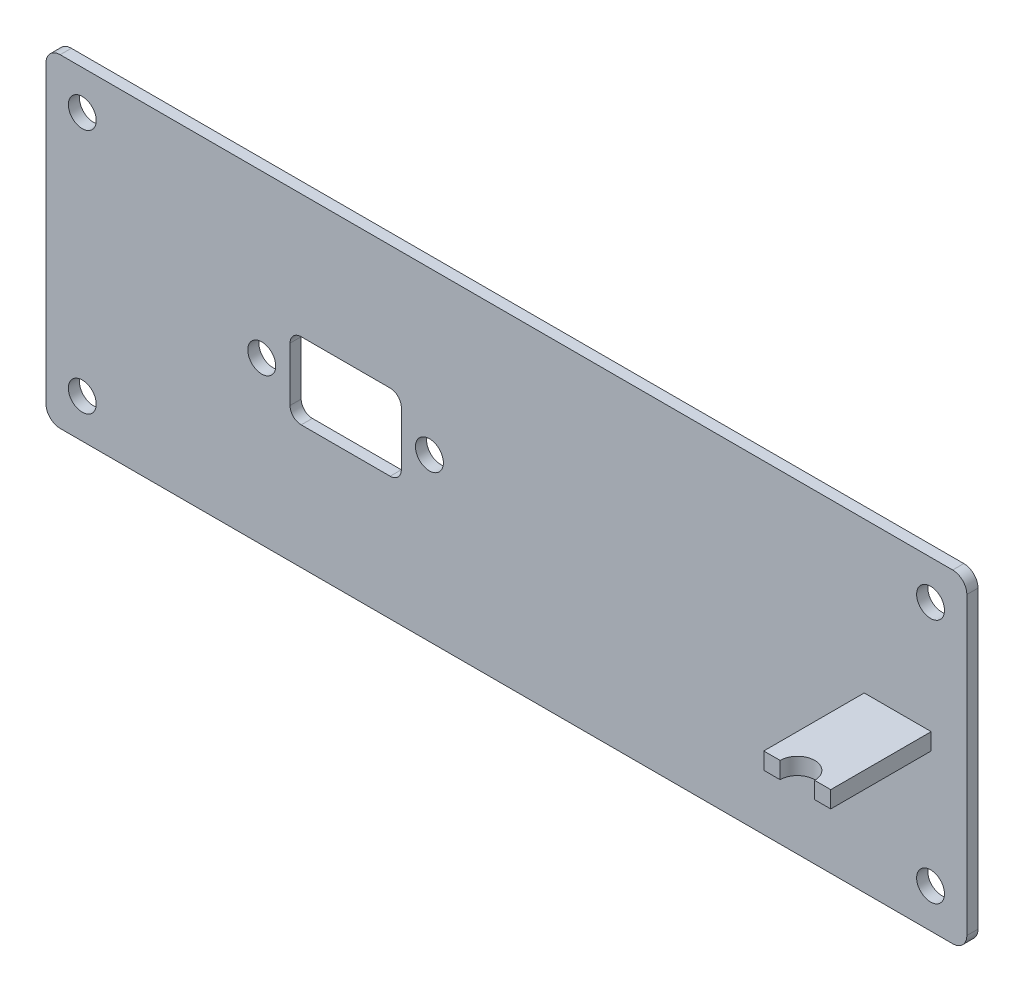
ISO-10303-21;
HEADER;
FILE_DESCRIPTION(('STEP AP214'),'2;1');
FILE_NAME('part.step','',(''),(''),'','','');
FILE_SCHEMA(('AUTOMOTIVE_DESIGN { 1 0 10303 214 1 1 1 1 }'));
ENDSEC;
DATA;
#1=APPLICATION_CONTEXT('core data for automotive mechanical design processes');
#2=APPLICATION_PROTOCOL_DEFINITION('international standard','automotive_design',2000,#1);
#3=PRODUCT_CONTEXT('',#1,'mechanical');
#4=PRODUCT('Part','Part','',(#3));
#5=PRODUCT_RELATED_PRODUCT_CATEGORY('part','',(#4));
#6=PRODUCT_DEFINITION_FORMATION('','',#4);
#7=PRODUCT_DEFINITION_CONTEXT('part definition',#1,'design');
#8=PRODUCT_DEFINITION('design','',#6,#7);
#9=PRODUCT_DEFINITION_SHAPE('','',#8);
#10=(LENGTH_UNIT() NAMED_UNIT(*) SI_UNIT(.MILLI.,.METRE.));
#11=(NAMED_UNIT(*) PLANE_ANGLE_UNIT() SI_UNIT($,.RADIAN.));
#12=(NAMED_UNIT(*) SI_UNIT($,.STERADIAN.) SOLID_ANGLE_UNIT());
#13=UNCERTAINTY_MEASURE_WITH_UNIT(LENGTH_MEASURE(1.E-05),#10,'distance_accuracy_value','');
#14=(GEOMETRIC_REPRESENTATION_CONTEXT(3) GLOBAL_UNCERTAINTY_ASSIGNED_CONTEXT((#13)) GLOBAL_UNIT_ASSIGNED_CONTEXT((#10,
#11,#12)) REPRESENTATION_CONTEXT('',''));
#15=CARTESIAN_POINT('',(0.,0.,0.));
#16=DIRECTION('',(0.,0.,1.));
#17=DIRECTION('',(1.,0.,0.));
#18=AXIS2_PLACEMENT_3D('',#15,#16,#17);
#19=CARTESIAN_POINT('',(80.7585054156569,15.4965306223011,10.));
#20=DIRECTION('',(0.,0.,-1.));
#21=DIRECTION('',(-1.,0.,0.));
#22=AXIS2_PLACEMENT_3D('',#19,#20,#21);
#23=PLANE('',#22);
#24=DIRECTION('',(0.,1.,0.));
#25=VECTOR('',#24,1.);
#26=CARTESIAN_POINT('',(79.3073020148032,15.4965306223011,10.));
#27=LINE('',#26,#25);
#28=CARTESIAN_POINT('',(79.3073020148032,15.4965306223011,10.));
#29=VERTEX_POINT('',#28);
#30=CARTESIAN_POINT('',(79.3073020148032,13.9965306223011,10.));
#31=VERTEX_POINT('',#30);
#32=EDGE_CURVE('E156',#29,#31,#27,.F.);
#33=ORIENTED_EDGE('',*,*,#32,.F.);
#34=DIRECTION('',(1.,0.,0.));
#35=VECTOR('',#34,1.);
#36=CARTESIAN_POINT('',(73.3073020148032,15.4965306223011,10.));
#37=LINE('',#36,#35);
#38=CARTESIAN_POINT('',(77.8682130895404,15.4965306223011,10.));
#39=VERTEX_POINT('',#38);
#40=EDGE_CURVE('E189',#39,#29,#37,.T.);
#41=ORIENTED_EDGE('',*,*,#40,.F.);
#42=DIRECTION('',(0.,-1.,0.));
#43=VECTOR('',#42,1.);
#44=CARTESIAN_POINT('',(77.8682130895404,15.4965306223011,10.));
#45=LINE('',#44,#43);
#46=CARTESIAN_POINT('',(77.8682130895404,13.9965306223011,10.));
#47=VERTEX_POINT('',#46);
#48=EDGE_CURVE('E335',#39,#47,#45,.T.);
#49=ORIENTED_EDGE('',*,*,#48,.T.);
#50=DIRECTION('',(1.,0.,0.));
#51=VECTOR('',#50,1.);
#52=CARTESIAN_POINT('',(79.3073020148032,13.9965306223011,10.));
#53=LINE('',#52,#51);
#54=EDGE_CURVE('E148',#31,#47,#53,.F.);
#55=ORIENTED_EDGE('',*,*,#54,.F.);
#56=EDGE_LOOP('',(#33,#41,#49,#55));
#57=FACE_BOUND('',#56,.T.);
#58=ADVANCED_FACE('F16',(#57),#23,.F.);
#59=CARTESIAN_POINT('',(79.3073020148032,15.4965306223011,1.));
#60=DIRECTION('',(1.,0.,0.));
#61=DIRECTION('',(0.,0.,-1.));
#62=AXIS2_PLACEMENT_3D('',#59,#60,#61);
#63=PLANE('',#62);
#64=DIRECTION('',(0.,1.,0.));
#65=VECTOR('',#64,1.);
#66=CARTESIAN_POINT('',(79.3073020148032,15.4965306223011,1.));
#67=LINE('',#66,#65);
#68=CARTESIAN_POINT('',(79.3073020148032,13.9965306223011,1.));
#69=VERTEX_POINT('',#68);
#70=CARTESIAN_POINT('',(79.3073020148032,15.4965306223011,1.));
#71=VERTEX_POINT('',#70);
#72=EDGE_CURVE('E171',#69,#71,#67,.T.);
#73=ORIENTED_EDGE('',*,*,#72,.T.);
#74=DIRECTION('',(0.,0.,1.));
#75=VECTOR('',#74,1.);
#76=CARTESIAN_POINT('',(79.3073020148032,15.4965306223011,1.));
#77=LINE('',#76,#75);
#78=EDGE_CURVE('E174',#29,#71,#77,.F.);
#79=ORIENTED_EDGE('',*,*,#78,.F.);
#80=ORIENTED_EDGE('',*,*,#32,.T.);
#81=DIRECTION('',(0.,0.,-1.));
#82=VECTOR('',#81,1.);
#83=CARTESIAN_POINT('',(79.3073020148032,13.9965306223011,1.));
#84=LINE('',#83,#82);
#85=EDGE_CURVE('E175',#69,#31,#84,.F.);
#86=ORIENTED_EDGE('',*,*,#85,.F.);
#87=EDGE_LOOP('',(#73,#79,#80,#86));
#88=FACE_BOUND('',#87,.T.);
#89=ADVANCED_FACE('F173',(#88),#63,.T.);
#90=CARTESIAN_POINT('',(73.3073020148032,13.9965306223011,1.));
#91=DIRECTION('',(-1.,0.,0.));
#92=DIRECTION('',(0.,0.,1.));
#93=AXIS2_PLACEMENT_3D('',#90,#91,#92);
#94=PLANE('',#93);
#95=DIRECTION('',(0.,1.,0.));
#96=VECTOR('',#95,1.);
#97=CARTESIAN_POINT('',(73.3073020148032,13.9965306223011,1.));
#98=LINE('',#97,#96);
#99=CARTESIAN_POINT('',(73.3073020148032,15.4965306223011,1.));
#100=VERTEX_POINT('',#99);
#101=CARTESIAN_POINT('',(73.3073020148032,13.9965306223011,1.));
#102=VERTEX_POINT('',#101);
#103=EDGE_CURVE('E180',#100,#102,#98,.F.);
#104=ORIENTED_EDGE('',*,*,#103,.T.);
#105=DIRECTION('',(0.,0.,-1.));
#106=VECTOR('',#105,1.);
#107=CARTESIAN_POINT('',(73.3073020148032,13.9965306223011,1.));
#108=LINE('',#107,#106);
#109=CARTESIAN_POINT('',(73.3073020148032,13.9965306223011,10.));
#110=VERTEX_POINT('',#109);
#111=EDGE_CURVE('E213',#110,#102,#108,.T.);
#112=ORIENTED_EDGE('',*,*,#111,.F.);
#113=DIRECTION('',(0.,1.,0.));
#114=VECTOR('',#113,1.);
#115=CARTESIAN_POINT('',(73.3073020148032,15.4965306223011,10.));
#116=LINE('',#115,#114);
#117=CARTESIAN_POINT('',(73.3073020148032,15.4965306223011,10.));
#118=VERTEX_POINT('',#117);
#119=EDGE_CURVE('E340',#110,#118,#116,.T.);
#120=ORIENTED_EDGE('',*,*,#119,.T.);
#121=DIRECTION('',(0.,0.,1.));
#122=VECTOR('',#121,1.);
#123=CARTESIAN_POINT('',(73.3073020148032,15.4965306223011,1.));
#124=LINE('',#123,#122);
#125=EDGE_CURVE('E190',#100,#118,#124,.T.);
#126=ORIENTED_EDGE('',*,*,#125,.F.);
#127=EDGE_LOOP('',(#104,#112,#120,#126));
#128=FACE_BOUND('',#127,.T.);
#129=ADVANCED_FACE('F349',(#128),#94,.T.);
#130=CARTESIAN_POINT('',(80.7585054156569,15.4965306223011,10.));
#131=DIRECTION('',(0.,0.,-1.));
#132=DIRECTION('',(-1.,0.,0.));
#133=AXIS2_PLACEMENT_3D('',#130,#131,#132);
#134=PLANE('',#133);
#135=DIRECTION('',(0.,-1.,0.));
#136=VECTOR('',#135,1.);
#137=CARTESIAN_POINT('',(74.7682130895404,15.4965306223011,10.));
#138=LINE('',#137,#136);
#139=CARTESIAN_POINT('',(74.7682130895404,13.9965306223011,10.));
#140=VERTEX_POINT('',#139);
#141=CARTESIAN_POINT('',(74.7682130895404,15.4965306223011,10.));
#142=VERTEX_POINT('',#141);
#143=EDGE_CURVE('E338',#140,#142,#138,.F.);
#144=ORIENTED_EDGE('',*,*,#143,.T.);
#145=DIRECTION('',(1.,0.,0.));
#146=VECTOR('',#145,1.);
#147=CARTESIAN_POINT('',(73.3073020148032,15.4965306223011,10.));
#148=LINE('',#147,#146);
#149=EDGE_CURVE('E316',#118,#142,#148,.T.);
#150=ORIENTED_EDGE('',*,*,#149,.F.);
#151=ORIENTED_EDGE('',*,*,#119,.F.);
#152=DIRECTION('',(1.,0.,0.));
#153=VECTOR('',#152,1.);
#154=CARTESIAN_POINT('',(79.3073020148032,13.9965306223011,10.));
#155=LINE('',#154,#153);
#156=EDGE_CURVE('E216',#140,#110,#155,.F.);
#157=ORIENTED_EDGE('',*,*,#156,.F.);
#158=EDGE_LOOP('',(#144,#150,#151,#157));
#159=FACE_BOUND('',#158,.T.);
#160=ADVANCED_FACE('F354',(#159),#134,.F.);
#161=CARTESIAN_POINT('',(76.3182130895404,15.4965306223011,10.));
#162=DIRECTION('',(0.,-1.,0.));
#163=DIRECTION('',(0.,0.,-1.));
#164=AXIS2_PLACEMENT_3D('',#161,#162,#163);
#165=CYLINDRICAL_SURFACE('',#164,1.55);
#166=ORIENTED_EDGE('',*,*,#48,.F.);
#167=CARTESIAN_POINT('',(76.3182130895404,15.4965306223011,10.));
#168=DIRECTION('',(0.,-1.,0.));
#169=DIRECTION('',(0.,0.,-1.));
#170=AXIS2_PLACEMENT_3D('',#167,#168,#169);
#171=CIRCLE('',#170,1.55);
#172=EDGE_CURVE('E200',#142,#39,#171,.T.);
#173=ORIENTED_EDGE('',*,*,#172,.F.);
#174=ORIENTED_EDGE('',*,*,#143,.F.);
#175=CARTESIAN_POINT('',(76.3182130895404,13.9965306223011,10.));
#176=DIRECTION('',(0.,-1.,0.));
#177=DIRECTION('',(0.,0.,-1.));
#178=AXIS2_PLACEMENT_3D('',#175,#176,#177);
#179=CIRCLE('',#178,1.55);
#180=EDGE_CURVE('E19',#47,#140,#179,.F.);
#181=ORIENTED_EDGE('',*,*,#180,.F.);
#182=EDGE_LOOP('',(#166,#173,#174,#181));
#183=FACE_BOUND('',#182,.T.);
#184=ADVANCED_FACE('F356',(#183),#165,.F.);
#185=CARTESIAN_POINT('',(79.3073020148032,13.9965306223011,1.));
#186=DIRECTION('',(0.,-1.,0.));
#187=DIRECTION('',(0.,0.,-1.));
#188=AXIS2_PLACEMENT_3D('',#185,#186,#187);
#189=PLANE('',#188);
#190=DIRECTION('',(1.,0.,0.));
#191=VECTOR('',#190,1.);
#192=CARTESIAN_POINT('',(41.25,13.9965306223011,1.));
#193=LINE('',#192,#191);
#194=EDGE_CURVE('E196',#69,#102,#193,.F.);
#195=ORIENTED_EDGE('',*,*,#194,.F.);
#196=ORIENTED_EDGE('',*,*,#85,.T.);
#197=ORIENTED_EDGE('',*,*,#54,.T.);
#198=ORIENTED_EDGE('',*,*,#180,.T.);
#199=ORIENTED_EDGE('',*,*,#156,.T.);
#200=ORIENTED_EDGE('',*,*,#111,.T.);
#201=EDGE_LOOP('',(#195,#196,#197,#198,#199,#200));
#202=FACE_BOUND('',#201,.T.);
#203=ADVANCED_FACE('F350',(#202),#189,.T.);
#204=CARTESIAN_POINT('',(73.3073020148032,15.4965306223011,1.));
#205=DIRECTION('',(0.,1.,0.));
#206=DIRECTION('',(0.,0.,1.));
#207=AXIS2_PLACEMENT_3D('',#204,#205,#206);
#208=PLANE('',#207);
#209=ORIENTED_EDGE('',*,*,#149,.T.);
#210=ORIENTED_EDGE('',*,*,#172,.T.);
#211=ORIENTED_EDGE('',*,*,#40,.T.);
#212=ORIENTED_EDGE('',*,*,#78,.T.);
#213=DIRECTION('',(1.,0.,0.));
#214=VECTOR('',#213,1.);
#215=CARTESIAN_POINT('',(41.25,15.4965306223011,1.));
#216=LINE('',#215,#214);
#217=EDGE_CURVE('E186',#100,#71,#216,.T.);
#218=ORIENTED_EDGE('',*,*,#217,.F.);
#219=ORIENTED_EDGE('',*,*,#125,.T.);
#220=EDGE_LOOP('',(#209,#210,#211,#212,#218,#219));
#221=FACE_BOUND('',#220,.T.);
#222=ADVANCED_FACE('F185',(#221),#208,.T.);
#223=CARTESIAN_POINT('',(41.25,14.5,1.));
#224=DIRECTION('',(0.,0.,1.));
#225=DIRECTION('',(1.,0.,0.));
#226=AXIS2_PLACEMENT_3D('',#223,#224,#225);
#227=PLANE('',#226);
#228=CARTESIAN_POINT('',(3.25,3.5,1.));
#229=DIRECTION('',(0.,0.,1.));
#230=DIRECTION('',(1.,0.,0.));
#231=AXIS2_PLACEMENT_3D('',#228,#229,#230);
#232=CIRCLE('',#231,1.25);
#233=CARTESIAN_POINT('',(4.5,3.5,1.));
#234=VERTEX_POINT('',#233);
#235=EDGE_CURVE('E269',#234,#234,#232,.F.);
#236=ORIENTED_EDGE('',*,*,#235,.T.);
#237=EDGE_LOOP('',(#236));
#238=FACE_BOUND('',#237,.T.);
#239=CARTESIAN_POINT('',(3.25,25.5,1.));
#240=DIRECTION('',(0.,0.,1.));
#241=DIRECTION('',(1.,0.,0.));
#242=AXIS2_PLACEMENT_3D('',#239,#240,#241);
#243=CIRCLE('',#242,1.25);
#244=CARTESIAN_POINT('',(4.5,25.5,1.));
#245=VERTEX_POINT('',#244);
#246=EDGE_CURVE('E272',#245,#245,#243,.F.);
#247=ORIENTED_EDGE('',*,*,#246,.T.);
#248=EDGE_LOOP('',(#247));
#249=FACE_BOUND('',#248,.T.);
#250=CARTESIAN_POINT('',(79.25,3.5,1.));
#251=DIRECTION('',(0.,0.,1.));
#252=DIRECTION('',(1.,0.,0.));
#253=AXIS2_PLACEMENT_3D('',#250,#251,#252);
#254=CIRCLE('',#253,1.25);
#255=CARTESIAN_POINT('',(80.5,3.5,1.));
#256=VERTEX_POINT('',#255);
#257=EDGE_CURVE('E275',#256,#256,#254,.F.);
#258=ORIENTED_EDGE('',*,*,#257,.T.);
#259=EDGE_LOOP('',(#258));
#260=FACE_BOUND('',#259,.T.);
#261=CARTESIAN_POINT('',(79.25,25.5,1.));
#262=DIRECTION('',(0.,0.,1.));
#263=DIRECTION('',(1.,0.,0.));
#264=AXIS2_PLACEMENT_3D('',#261,#262,#263);
#265=CIRCLE('',#264,1.25);
#266=CARTESIAN_POINT('',(80.5,25.5,1.));
#267=VERTEX_POINT('',#266);
#268=EDGE_CURVE('E278',#267,#267,#265,.F.);
#269=ORIENTED_EDGE('',*,*,#268,.T.);
#270=EDGE_LOOP('',(#269));
#271=FACE_BOUND('',#270,.T.);
#272=CARTESIAN_POINT('',(30.8339337722122,12.077765131336,1.));
#273=DIRECTION('',(0.,0.,-1.));
#274=DIRECTION('',(-1.,0.,0.));
#275=AXIS2_PLACEMENT_3D('',#272,#273,#274);
#276=CIRCLE('',#275,1.00000000000001);
#277=CARTESIAN_POINT('',(31.8339337722122,12.077765131336,1.));
#278=VERTEX_POINT('',#277);
#279=CARTESIAN_POINT('',(30.8339337722122,11.077765131336,1.));
#280=VERTEX_POINT('',#279);
#281=EDGE_CURVE('E285',#278,#280,#276,.T.);
#282=ORIENTED_EDGE('',*,*,#281,.T.);
#283=DIRECTION('',(1.,0.,0.));
#284=VECTOR('',#283,1.);
#285=CARTESIAN_POINT('',(22.8629419124941,11.077765131336,1.));
#286=LINE('',#285,#284);
#287=CARTESIAN_POINT('',(22.8629419124941,11.077765131336,1.));
#288=VERTEX_POINT('',#287);
#289=EDGE_CURVE('E734',#280,#288,#286,.F.);
#290=ORIENTED_EDGE('',*,*,#289,.T.);
#291=CARTESIAN_POINT('',(22.8629419124941,12.077765131336,1.));
#292=DIRECTION('',(0.,0.,-1.));
#293=DIRECTION('',(-1.,0.,0.));
#294=AXIS2_PLACEMENT_3D('',#291,#292,#293);
#295=CIRCLE('',#294,1.00000000000001);
#296=CARTESIAN_POINT('',(21.8629419124941,12.077765131336,1.));
#297=VERTEX_POINT('',#296);
#298=EDGE_CURVE('E282',#288,#297,#295,.T.);
#299=ORIENTED_EDGE('',*,*,#298,.T.);
#300=DIRECTION('',(0.,1.,0.));
#301=VECTOR('',#300,1.);
#302=CARTESIAN_POINT('',(21.8629419124941,16.9156213160424,1.));
#303=LINE('',#302,#301);
#304=CARTESIAN_POINT('',(21.8629419124941,16.9156213160424,1.));
#305=VERTEX_POINT('',#304);
#306=EDGE_CURVE('E300',#297,#305,#303,.T.);
#307=ORIENTED_EDGE('',*,*,#306,.T.);
#308=CARTESIAN_POINT('',(22.8629419124941,16.9156213160424,1.));
#309=DIRECTION('',(0.,0.,-1.));
#310=DIRECTION('',(-1.,0.,0.));
#311=AXIS2_PLACEMENT_3D('',#308,#309,#310);
#312=CIRCLE('',#311,1.);
#313=CARTESIAN_POINT('',(22.8629419124941,17.9156213160424,1.));
#314=VERTEX_POINT('',#313);
#315=EDGE_CURVE('E293',#305,#314,#312,.T.);
#316=ORIENTED_EDGE('',*,*,#315,.T.);
#317=DIRECTION('',(1.,0.,0.));
#318=VECTOR('',#317,1.);
#319=CARTESIAN_POINT('',(30.8339337722122,17.9156213160424,1.));
#320=LINE('',#319,#318);
#321=CARTESIAN_POINT('',(30.8339337722122,17.9156213160424,1.));
#322=VERTEX_POINT('',#321);
#323=EDGE_CURVE('E744',#314,#322,#320,.T.);
#324=ORIENTED_EDGE('',*,*,#323,.T.);
#325=CARTESIAN_POINT('',(30.8339337722122,16.9156213160424,1.));
#326=DIRECTION('',(0.,0.,-1.));
#327=DIRECTION('',(-1.,0.,0.));
#328=AXIS2_PLACEMENT_3D('',#325,#326,#327);
#329=CIRCLE('',#328,1.);
#330=CARTESIAN_POINT('',(31.8339337722122,16.9156213160424,1.));
#331=VERTEX_POINT('',#330);
#332=EDGE_CURVE('E289',#322,#331,#329,.T.);
#333=ORIENTED_EDGE('',*,*,#332,.T.);
#334=DIRECTION('',(0.,1.,0.));
#335=VECTOR('',#334,1.);
#336=CARTESIAN_POINT('',(31.8339337722122,12.077765131336,1.));
#337=LINE('',#336,#335);
#338=EDGE_CURVE('E739',#331,#278,#337,.F.);
#339=ORIENTED_EDGE('',*,*,#338,.T.);
#340=EDGE_LOOP('',(#282,#290,#299,#307,#316,#324,#333,#339));
#341=FACE_BOUND('',#340,.T.);
#342=CARTESIAN_POINT('',(19.3286573145204,14.5,1.));
#343=DIRECTION('',(0.,0.,1.));
#344=DIRECTION('',(1.,0.,0.));
#345=AXIS2_PLACEMENT_3D('',#342,#343,#344);
#346=CIRCLE('',#345,1.25);
#347=CARTESIAN_POINT('',(20.5786573145204,14.5,1.));
#348=VERTEX_POINT('',#347);
#349=EDGE_CURVE('E297',#348,#348,#346,.F.);
#350=ORIENTED_EDGE('',*,*,#349,.T.);
#351=EDGE_LOOP('',(#350));
#352=FACE_BOUND('',#351,.T.);
#353=CARTESIAN_POINT('',(34.350704027088,14.5,1.));
#354=DIRECTION('',(0.,0.,1.));
#355=DIRECTION('',(1.,0.,0.));
#356=AXIS2_PLACEMENT_3D('',#353,#354,#355);
#357=CIRCLE('',#356,1.25);
#358=CARTESIAN_POINT('',(35.600704027088,14.5,1.));
#359=VERTEX_POINT('',#358);
#360=EDGE_CURVE('E301',#359,#359,#357,.F.);
#361=ORIENTED_EDGE('',*,*,#360,.T.);
#362=EDGE_LOOP('',(#361));
#363=FACE_BOUND('',#362,.T.);
#364=ORIENTED_EDGE('',*,*,#103,.F.);
#365=ORIENTED_EDGE('',*,*,#217,.T.);
#366=ORIENTED_EDGE('',*,*,#72,.F.);
#367=ORIENTED_EDGE('',*,*,#194,.T.);
#368=EDGE_LOOP('',(#364,#365,#366,#367));
#369=FACE_BOUND('',#368,.T.);
#370=CARTESIAN_POINT('',(81.23,27.73,1.));
#371=DIRECTION('',(0.,0.,1.));
#372=DIRECTION('',(1.,0.,0.));
#373=AXIS2_PLACEMENT_3D('',#370,#371,#372);
#374=CIRCLE('',#373,1.27000000000001);
#375=CARTESIAN_POINT('',(81.23,29.,1.));
#376=VERTEX_POINT('',#375);
#377=CARTESIAN_POINT('',(82.5,27.73,1.));
#378=VERTEX_POINT('',#377);
#379=EDGE_CURVE('E309',#376,#378,#374,.F.);
#380=ORIENTED_EDGE('',*,*,#379,.F.);
#381=DIRECTION('',(1.,0.,0.));
#382=VECTOR('',#381,1.);
#383=CARTESIAN_POINT('',(1.27000000000001,29.,1.));
#384=LINE('',#383,#382);
#385=CARTESIAN_POINT('',(1.27,29.,1.));
#386=VERTEX_POINT('',#385);
#387=EDGE_CURVE('E756',#386,#376,#384,.T.);
#388=ORIENTED_EDGE('',*,*,#387,.F.);
#389=CARTESIAN_POINT('',(1.27,27.73,1.));
#390=DIRECTION('',(0.,0.,1.));
#391=DIRECTION('',(1.,0.,0.));
#392=AXIS2_PLACEMENT_3D('',#389,#390,#391);
#393=CIRCLE('',#392,1.27);
#394=CARTESIAN_POINT('',(0.,27.73,1.));
#395=VERTEX_POINT('',#394);
#396=EDGE_CURVE('E305',#395,#386,#393,.F.);
#397=ORIENTED_EDGE('',*,*,#396,.F.);
#398=DIRECTION('',(0.,1.,0.));
#399=VECTOR('',#398,1.);
#400=CARTESIAN_POINT('',(0.,1.27,1.));
#401=LINE('',#400,#399);
#402=CARTESIAN_POINT('',(0.,1.27,1.));
#403=VERTEX_POINT('',#402);
#404=EDGE_CURVE('E751',#403,#395,#401,.T.);
#405=ORIENTED_EDGE('',*,*,#404,.F.);
#406=CARTESIAN_POINT('',(1.27,1.27,1.));
#407=DIRECTION('',(0.,0.,1.));
#408=DIRECTION('',(1.,0.,0.));
#409=AXIS2_PLACEMENT_3D('',#406,#407,#408);
#410=CIRCLE('',#409,1.27);
#411=CARTESIAN_POINT('',(1.27,0.,1.));
#412=VERTEX_POINT('',#411);
#413=EDGE_CURVE('E195',#412,#403,#410,.F.);
#414=ORIENTED_EDGE('',*,*,#413,.F.);
#415=DIRECTION('',(1.,0.,0.));
#416=VECTOR('',#415,1.);
#417=CARTESIAN_POINT('',(81.23,0.,1.));
#418=LINE('',#417,#416);
#419=CARTESIAN_POINT('',(81.23,0.,1.));
#420=VERTEX_POINT('',#419);
#421=EDGE_CURVE('E198',#420,#412,#418,.F.);
#422=ORIENTED_EDGE('',*,*,#421,.F.);
#423=CARTESIAN_POINT('',(81.23,1.27000000000002,1.));
#424=DIRECTION('',(0.,0.,1.));
#425=DIRECTION('',(1.,0.,0.));
#426=AXIS2_PLACEMENT_3D('',#423,#424,#425);
#427=CIRCLE('',#426,1.27000000000001);
#428=CARTESIAN_POINT('',(82.5,1.27000000000001,1.));
#429=VERTEX_POINT('',#428);
#430=EDGE_CURVE('E313',#429,#420,#427,.F.);
#431=ORIENTED_EDGE('',*,*,#430,.F.);
#432=DIRECTION('',(0.,1.,0.));
#433=VECTOR('',#432,1.);
#434=CARTESIAN_POINT('',(82.5,27.73,1.));
#435=LINE('',#434,#433);
#436=EDGE_CURVE('E759',#378,#429,#435,.F.);
#437=ORIENTED_EDGE('',*,*,#436,.F.);
#438=EDGE_LOOP('',(#380,#388,#397,#405,#414,#422,#431,#437));
#439=FACE_BOUND('',#438,.T.);
#440=ADVANCED_FACE('F192',(#238,#249,#260,#271,#341,#352,#363,#369,#439),#227,.T.);
#441=CARTESIAN_POINT('',(1.27,1.27,0.));
#442=DIRECTION('',(0.,0.,1.));
#443=DIRECTION('',(1.,0.,0.));
#444=AXIS2_PLACEMENT_3D('',#441,#442,#443);
#445=CYLINDRICAL_SURFACE('',#444,1.27);
#446=CARTESIAN_POINT('',(1.27,1.27,0.));
#447=DIRECTION('',(0.,0.,1.));
#448=DIRECTION('',(1.,0.,0.));
#449=AXIS2_PLACEMENT_3D('',#446,#447,#448);
#450=CIRCLE('',#449,1.27);
#451=CARTESIAN_POINT('',(0.,1.27,0.));
#452=VERTEX_POINT('',#451);
#453=CARTESIAN_POINT('',(1.27,0.,0.));
#454=VERTEX_POINT('',#453);
#455=EDGE_CURVE('E266',#452,#454,#450,.T.);
#456=ORIENTED_EDGE('',*,*,#455,.T.);
#457=DIRECTION('',(0.,0.,-1.));
#458=VECTOR('',#457,1.);
#459=CARTESIAN_POINT('',(1.26999999999999,0.,0.));
#460=LINE('',#459,#458);
#461=EDGE_CURVE('E315',#412,#454,#460,.T.);
#462=ORIENTED_EDGE('',*,*,#461,.F.);
#463=ORIENTED_EDGE('',*,*,#413,.T.);
#464=DIRECTION('',(0.,0.,1.));
#465=VECTOR('',#464,1.);
#466=CARTESIAN_POINT('',(0.,1.27,0.));
#467=LINE('',#466,#465);
#468=EDGE_CURVE('E304',#452,#403,#467,.T.);
#469=ORIENTED_EDGE('',*,*,#468,.F.);
#470=EDGE_LOOP('',(#456,#462,#463,#469));
#471=FACE_BOUND('',#470,.T.);
#472=ADVANCED_FACE('F454',(#471),#445,.T.);
#473=CARTESIAN_POINT('',(81.23,0.,0.));
#474=DIRECTION('',(0.,-1.,0.));
#475=DIRECTION('',(0.,0.,-1.));
#476=AXIS2_PLACEMENT_3D('',#473,#474,#475);
#477=PLANE('',#476);
#478=DIRECTION('',(1.,0.,0.));
#479=VECTOR('',#478,1.);
#480=CARTESIAN_POINT('',(41.25,0.,0.));
#481=LINE('',#480,#479);
#482=CARTESIAN_POINT('',(81.23,0.,0.));
#483=VERTEX_POINT('',#482);
#484=EDGE_CURVE('E265',#454,#483,#481,.T.);
#485=ORIENTED_EDGE('',*,*,#484,.T.);
#486=DIRECTION('',(0.,0.,1.));
#487=VECTOR('',#486,1.);
#488=CARTESIAN_POINT('',(81.23,0.,0.));
#489=LINE('',#488,#487);
#490=EDGE_CURVE('E314',#420,#483,#489,.F.);
#491=ORIENTED_EDGE('',*,*,#490,.F.);
#492=ORIENTED_EDGE('',*,*,#421,.T.);
#493=ORIENTED_EDGE('',*,*,#461,.T.);
#494=EDGE_LOOP('',(#485,#491,#492,#493));
#495=FACE_BOUND('',#494,.T.);
#496=ADVANCED_FACE('F450',(#495),#477,.T.);
#497=CARTESIAN_POINT('',(81.23,1.27000000000002,0.));
#498=DIRECTION('',(0.,0.,1.));
#499=DIRECTION('',(1.,0.,0.));
#500=AXIS2_PLACEMENT_3D('',#497,#498,#499);
#501=CYLINDRICAL_SURFACE('',#500,1.27000000000001);
#502=CARTESIAN_POINT('',(81.23,1.27000000000002,0.));
#503=DIRECTION('',(0.,0.,1.));
#504=DIRECTION('',(1.,0.,0.));
#505=AXIS2_PLACEMENT_3D('',#502,#503,#504);
#506=CIRCLE('',#505,1.27000000000001);
#507=CARTESIAN_POINT('',(82.5,1.27000000000001,0.));
#508=VERTEX_POINT('',#507);
#509=EDGE_CURVE('E262',#483,#508,#506,.T.);
#510=ORIENTED_EDGE('',*,*,#509,.T.);
#511=DIRECTION('',(0.,0.,-1.));
#512=VECTOR('',#511,1.);
#513=CARTESIAN_POINT('',(82.5,1.27,0.));
#514=LINE('',#513,#512);
#515=EDGE_CURVE('E312',#429,#508,#514,.T.);
#516=ORIENTED_EDGE('',*,*,#515,.F.);
#517=ORIENTED_EDGE('',*,*,#430,.T.);
#518=ORIENTED_EDGE('',*,*,#490,.T.);
#519=EDGE_LOOP('',(#510,#516,#517,#518));
#520=FACE_BOUND('',#519,.T.);
#521=ADVANCED_FACE('F446',(#520),#501,.T.);
#522=CARTESIAN_POINT('',(82.5,27.73,0.));
#523=DIRECTION('',(1.,0.,0.));
#524=DIRECTION('',(0.,0.,-1.));
#525=AXIS2_PLACEMENT_3D('',#522,#523,#524);
#526=PLANE('',#525);
#527=DIRECTION('',(0.,1.,0.));
#528=VECTOR('',#527,1.);
#529=CARTESIAN_POINT('',(82.5,14.5,0.));
#530=LINE('',#529,#528);
#531=CARTESIAN_POINT('',(82.5,27.73,0.));
#532=VERTEX_POINT('',#531);
#533=EDGE_CURVE('E261',#508,#532,#530,.T.);
#534=ORIENTED_EDGE('',*,*,#533,.T.);
#535=DIRECTION('',(0.,0.,1.));
#536=VECTOR('',#535,1.);
#537=CARTESIAN_POINT('',(82.5,27.73,0.));
#538=LINE('',#537,#536);
#539=EDGE_CURVE('E311',#378,#532,#538,.F.);
#540=ORIENTED_EDGE('',*,*,#539,.F.);
#541=ORIENTED_EDGE('',*,*,#436,.T.);
#542=ORIENTED_EDGE('',*,*,#515,.T.);
#543=EDGE_LOOP('',(#534,#540,#541,#542));
#544=FACE_BOUND('',#543,.T.);
#545=ADVANCED_FACE('F442',(#544),#526,.T.);
#546=CARTESIAN_POINT('',(81.23,27.73,0.));
#547=DIRECTION('',(0.,0.,1.));
#548=DIRECTION('',(1.,0.,0.));
#549=AXIS2_PLACEMENT_3D('',#546,#547,#548);
#550=CYLINDRICAL_SURFACE('',#549,1.27000000000001);
#551=CARTESIAN_POINT('',(81.23,27.73,0.));
#552=DIRECTION('',(0.,0.,1.));
#553=DIRECTION('',(1.,0.,0.));
#554=AXIS2_PLACEMENT_3D('',#551,#552,#553);
#555=CIRCLE('',#554,1.27000000000001);
#556=CARTESIAN_POINT('',(81.23,29.,0.));
#557=VERTEX_POINT('',#556);
#558=EDGE_CURVE('E258',#532,#557,#555,.T.);
#559=ORIENTED_EDGE('',*,*,#558,.T.);
#560=DIRECTION('',(0.,0.,1.));
#561=VECTOR('',#560,1.);
#562=CARTESIAN_POINT('',(81.23,29.,0.));
#563=LINE('',#562,#561);
#564=EDGE_CURVE('E308',#376,#557,#563,.F.);
#565=ORIENTED_EDGE('',*,*,#564,.F.);
#566=ORIENTED_EDGE('',*,*,#379,.T.);
#567=ORIENTED_EDGE('',*,*,#539,.T.);
#568=EDGE_LOOP('',(#559,#565,#566,#567));
#569=FACE_BOUND('',#568,.T.);
#570=ADVANCED_FACE('F438',(#569),#550,.T.);
#571=CARTESIAN_POINT('',(1.27000000000001,29.,0.));
#572=DIRECTION('',(0.,1.,0.));
#573=DIRECTION('',(0.,0.,1.));
#574=AXIS2_PLACEMENT_3D('',#571,#572,#573);
#575=PLANE('',#574);
#576=DIRECTION('',(1.,0.,0.));
#577=VECTOR('',#576,1.);
#578=CARTESIAN_POINT('',(41.25,29.,0.));
#579=LINE('',#578,#577);
#580=CARTESIAN_POINT('',(1.27,29.,0.));
#581=VERTEX_POINT('',#580);
#582=EDGE_CURVE('E257',#557,#581,#579,.F.);
#583=ORIENTED_EDGE('',*,*,#582,.T.);
#584=DIRECTION('',(0.,0.,1.));
#585=VECTOR('',#584,1.);
#586=CARTESIAN_POINT('',(1.27000000000001,29.,0.));
#587=LINE('',#586,#585);
#588=EDGE_CURVE('E307',#386,#581,#587,.F.);
#589=ORIENTED_EDGE('',*,*,#588,.F.);
#590=ORIENTED_EDGE('',*,*,#387,.T.);
#591=ORIENTED_EDGE('',*,*,#564,.T.);
#592=EDGE_LOOP('',(#583,#589,#590,#591));
#593=FACE_BOUND('',#592,.T.);
#594=ADVANCED_FACE('F434',(#593),#575,.T.);
#595=CARTESIAN_POINT('',(1.27,27.73,0.));
#596=DIRECTION('',(0.,0.,1.));
#597=DIRECTION('',(1.,0.,0.));
#598=AXIS2_PLACEMENT_3D('',#595,#596,#597);
#599=CYLINDRICAL_SURFACE('',#598,1.27);
#600=CARTESIAN_POINT('',(1.27,27.73,0.));
#601=DIRECTION('',(0.,0.,1.));
#602=DIRECTION('',(1.,0.,0.));
#603=AXIS2_PLACEMENT_3D('',#600,#601,#602);
#604=CIRCLE('',#603,1.27);
#605=CARTESIAN_POINT('',(0.,27.73,0.));
#606=VERTEX_POINT('',#605);
#607=EDGE_CURVE('E254',#581,#606,#604,.T.);
#608=ORIENTED_EDGE('',*,*,#607,.T.);
#609=DIRECTION('',(0.,0.,1.));
#610=VECTOR('',#609,1.);
#611=CARTESIAN_POINT('',(0.,27.73,0.));
#612=LINE('',#611,#610);
#613=EDGE_CURVE('E749',#395,#606,#612,.F.);
#614=ORIENTED_EDGE('',*,*,#613,.F.);
#615=ORIENTED_EDGE('',*,*,#396,.T.);
#616=ORIENTED_EDGE('',*,*,#588,.T.);
#617=EDGE_LOOP('',(#608,#614,#615,#616));
#618=FACE_BOUND('',#617,.T.);
#619=ADVANCED_FACE('F430',(#618),#599,.T.);
#620=CARTESIAN_POINT('',(0.,1.27,0.));
#621=DIRECTION('',(-1.,0.,0.));
#622=DIRECTION('',(0.,0.,1.));
#623=AXIS2_PLACEMENT_3D('',#620,#621,#622);
#624=PLANE('',#623);
#625=DIRECTION('',(0.,1.,0.));
#626=VECTOR('',#625,1.);
#627=CARTESIAN_POINT('',(0.,14.5,0.));
#628=LINE('',#627,#626);
#629=EDGE_CURVE('E253',#606,#452,#628,.F.);
#630=ORIENTED_EDGE('',*,*,#629,.T.);
#631=ORIENTED_EDGE('',*,*,#468,.T.);
#632=ORIENTED_EDGE('',*,*,#404,.T.);
#633=ORIENTED_EDGE('',*,*,#613,.T.);
#634=EDGE_LOOP('',(#630,#631,#632,#633));
#635=FACE_BOUND('',#634,.T.);
#636=ADVANCED_FACE('F426',(#635),#624,.T.);
#637=CARTESIAN_POINT('',(34.350704027088,14.5,-3.));
#638=DIRECTION('',(0.,0.,1.));
#639=DIRECTION('',(1.,0.,0.));
#640=AXIS2_PLACEMENT_3D('',#637,#638,#639);
#641=CYLINDRICAL_SURFACE('',#640,1.25);
#642=ORIENTED_EDGE('',*,*,#360,.F.);
#643=EDGE_LOOP('',(#642));
#644=FACE_BOUND('',#643,.T.);
#645=CARTESIAN_POINT('',(34.350704027088,14.5,0.));
#646=DIRECTION('',(0.,0.,1.));
#647=DIRECTION('',(1.,0.,0.));
#648=AXIS2_PLACEMENT_3D('',#645,#646,#647);
#649=CIRCLE('',#648,1.25);
#650=CARTESIAN_POINT('',(35.600704027088,14.5,0.));
#651=VERTEX_POINT('',#650);
#652=EDGE_CURVE('E250',#651,#651,#649,.F.);
#653=ORIENTED_EDGE('',*,*,#652,.T.);
#654=EDGE_LOOP('',(#653));
#655=FACE_BOUND('',#654,.T.);
#656=ADVANCED_FACE('F422',(#644,#655),#641,.F.);
#657=CARTESIAN_POINT('',(19.3286573145204,14.5,-3.));
#658=DIRECTION('',(0.,0.,1.));
#659=DIRECTION('',(1.,0.,0.));
#660=AXIS2_PLACEMENT_3D('',#657,#658,#659);
#661=CYLINDRICAL_SURFACE('',#660,1.25);
#662=ORIENTED_EDGE('',*,*,#349,.F.);
#663=EDGE_LOOP('',(#662));
#664=FACE_BOUND('',#663,.T.);
#665=CARTESIAN_POINT('',(19.3286573145204,14.5,0.));
#666=DIRECTION('',(0.,0.,1.));
#667=DIRECTION('',(1.,0.,0.));
#668=AXIS2_PLACEMENT_3D('',#665,#666,#667);
#669=CIRCLE('',#668,1.25);
#670=CARTESIAN_POINT('',(20.5786573145204,14.5,0.));
#671=VERTEX_POINT('',#670);
#672=EDGE_CURVE('E247',#671,#671,#669,.F.);
#673=ORIENTED_EDGE('',*,*,#672,.T.);
#674=EDGE_LOOP('',(#673));
#675=FACE_BOUND('',#674,.T.);
#676=ADVANCED_FACE('F418',(#664,#675),#661,.F.);
#677=CARTESIAN_POINT('',(21.8629419124941,16.9156213160424,1.));
#678=DIRECTION('',(-1.,0.,0.));
#679=DIRECTION('',(0.,0.,1.));
#680=AXIS2_PLACEMENT_3D('',#677,#678,#679);
#681=PLANE('',#680);
#682=DIRECTION('',(0.,0.,-1.));
#683=VECTOR('',#682,1.);
#684=CARTESIAN_POINT('',(21.8629419124941,16.9156213160424,1.));
#685=LINE('',#684,#683);
#686=CARTESIAN_POINT('',(21.8629419124941,16.9156213160424,0.));
#687=VERTEX_POINT('',#686);
#688=EDGE_CURVE('E296',#687,#305,#685,.F.);
#689=ORIENTED_EDGE('',*,*,#688,.T.);
#690=ORIENTED_EDGE('',*,*,#306,.F.);
#691=DIRECTION('',(0.,0.,-1.));
#692=VECTOR('',#691,1.);
#693=CARTESIAN_POINT('',(21.8629419124941,12.077765131336,1.));
#694=LINE('',#693,#692);
#695=CARTESIAN_POINT('',(21.8629419124941,12.077765131336,0.));
#696=VERTEX_POINT('',#695);
#697=EDGE_CURVE('E281',#297,#696,#694,.T.);
#698=ORIENTED_EDGE('',*,*,#697,.T.);
#699=DIRECTION('',(0.,1.,0.));
#700=VECTOR('',#699,1.);
#701=CARTESIAN_POINT('',(21.8629419124941,14.5,0.));
#702=LINE('',#701,#700);
#703=EDGE_CURVE('E246',#696,#687,#702,.T.);
#704=ORIENTED_EDGE('',*,*,#703,.T.);
#705=EDGE_LOOP('',(#689,#690,#698,#704));
#706=FACE_BOUND('',#705,.T.);
#707=ADVANCED_FACE('F414',(#706),#681,.F.);
#708=CARTESIAN_POINT('',(22.8629419124941,16.9156213160424,1.));
#709=DIRECTION('',(0.,0.,-1.));
#710=DIRECTION('',(-1.,0.,0.));
#711=AXIS2_PLACEMENT_3D('',#708,#709,#710);
#712=CYLINDRICAL_SURFACE('',#711,1.);
#713=DIRECTION('',(0.,0.,1.));
#714=VECTOR('',#713,1.);
#715=CARTESIAN_POINT('',(22.8629419124941,17.9156213160424,1.));
#716=LINE('',#715,#714);
#717=CARTESIAN_POINT('',(22.8629419124941,17.9156213160424,0.));
#718=VERTEX_POINT('',#717);
#719=EDGE_CURVE('E295',#718,#314,#716,.T.);
#720=ORIENTED_EDGE('',*,*,#719,.T.);
#721=ORIENTED_EDGE('',*,*,#315,.F.);
#722=ORIENTED_EDGE('',*,*,#688,.F.);
#723=CARTESIAN_POINT('',(22.8629419124941,16.9156213160424,0.));
#724=DIRECTION('',(0.,0.,-1.));
#725=DIRECTION('',(-1.,0.,0.));
#726=AXIS2_PLACEMENT_3D('',#723,#724,#725);
#727=CIRCLE('',#726,1.);
#728=EDGE_CURVE('E243',#687,#718,#727,.T.);
#729=ORIENTED_EDGE('',*,*,#728,.T.);
#730=EDGE_LOOP('',(#720,#721,#722,#729));
#731=FACE_BOUND('',#730,.T.);
#732=ADVANCED_FACE('F410',(#731),#712,.F.);
#733=CARTESIAN_POINT('',(30.8339337722122,17.9156213160424,1.));
#734=DIRECTION('',(0.,1.,0.));
#735=DIRECTION('',(0.,0.,1.));
#736=AXIS2_PLACEMENT_3D('',#733,#734,#735);
#737=PLANE('',#736);
#738=DIRECTION('',(0.,0.,-1.));
#739=VECTOR('',#738,1.);
#740=CARTESIAN_POINT('',(30.8339337722122,17.9156213160424,1.));
#741=LINE('',#740,#739);
#742=CARTESIAN_POINT('',(30.8339337722122,17.9156213160424,0.));
#743=VERTEX_POINT('',#742);
#744=EDGE_CURVE('E292',#743,#322,#741,.F.);
#745=ORIENTED_EDGE('',*,*,#744,.T.);
#746=ORIENTED_EDGE('',*,*,#323,.F.);
#747=ORIENTED_EDGE('',*,*,#719,.F.);
#748=DIRECTION('',(1.,0.,0.));
#749=VECTOR('',#748,1.);
#750=CARTESIAN_POINT('',(41.25,17.9156213160424,0.));
#751=LINE('',#750,#749);
#752=EDGE_CURVE('E242',#718,#743,#751,.T.);
#753=ORIENTED_EDGE('',*,*,#752,.T.);
#754=EDGE_LOOP('',(#745,#746,#747,#753));
#755=FACE_BOUND('',#754,.T.);
#756=ADVANCED_FACE('F406',(#755),#737,.F.);
#757=CARTESIAN_POINT('',(30.8339337722122,16.9156213160424,1.));
#758=DIRECTION('',(0.,0.,-1.));
#759=DIRECTION('',(-1.,0.,0.));
#760=AXIS2_PLACEMENT_3D('',#757,#758,#759);
#761=CYLINDRICAL_SURFACE('',#760,1.);
#762=DIRECTION('',(0.,0.,-1.));
#763=VECTOR('',#762,1.);
#764=CARTESIAN_POINT('',(31.8339337722122,16.9156213160424,1.));
#765=LINE('',#764,#763);
#766=CARTESIAN_POINT('',(31.8339337722122,16.9156213160424,0.));
#767=VERTEX_POINT('',#766);
#768=EDGE_CURVE('E291',#767,#331,#765,.F.);
#769=ORIENTED_EDGE('',*,*,#768,.T.);
#770=ORIENTED_EDGE('',*,*,#332,.F.);
#771=ORIENTED_EDGE('',*,*,#744,.F.);
#772=CARTESIAN_POINT('',(30.8339337722122,16.9156213160424,0.));
#773=DIRECTION('',(0.,0.,-1.));
#774=DIRECTION('',(-1.,0.,0.));
#775=AXIS2_PLACEMENT_3D('',#772,#773,#774);
#776=CIRCLE('',#775,1.);
#777=EDGE_CURVE('E239',#743,#767,#776,.T.);
#778=ORIENTED_EDGE('',*,*,#777,.T.);
#779=EDGE_LOOP('',(#769,#770,#771,#778));
#780=FACE_BOUND('',#779,.T.);
#781=ADVANCED_FACE('F402',(#780),#761,.F.);
#782=CARTESIAN_POINT('',(31.8339337722122,12.077765131336,1.));
#783=DIRECTION('',(1.,0.,0.));
#784=DIRECTION('',(0.,0.,-1.));
#785=AXIS2_PLACEMENT_3D('',#782,#783,#784);
#786=PLANE('',#785);
#787=DIRECTION('',(0.,0.,-1.));
#788=VECTOR('',#787,1.);
#789=CARTESIAN_POINT('',(31.8339337722122,12.077765131336,1.));
#790=LINE('',#789,#788);
#791=CARTESIAN_POINT('',(31.8339337722122,12.077765131336,0.));
#792=VERTEX_POINT('',#791);
#793=EDGE_CURVE('E288',#792,#278,#790,.F.);
#794=ORIENTED_EDGE('',*,*,#793,.T.);
#795=ORIENTED_EDGE('',*,*,#338,.F.);
#796=ORIENTED_EDGE('',*,*,#768,.F.);
#797=DIRECTION('',(0.,1.,0.));
#798=VECTOR('',#797,1.);
#799=CARTESIAN_POINT('',(31.8339337722122,14.5,0.));
#800=LINE('',#799,#798);
#801=EDGE_CURVE('E238',#767,#792,#800,.F.);
#802=ORIENTED_EDGE('',*,*,#801,.T.);
#803=EDGE_LOOP('',(#794,#795,#796,#802));
#804=FACE_BOUND('',#803,.T.);
#805=ADVANCED_FACE('F398',(#804),#786,.F.);
#806=CARTESIAN_POINT('',(30.8339337722122,12.077765131336,1.));
#807=DIRECTION('',(0.,0.,-1.));
#808=DIRECTION('',(-1.,0.,0.));
#809=AXIS2_PLACEMENT_3D('',#806,#807,#808);
#810=CYLINDRICAL_SURFACE('',#809,1.00000000000001);
#811=DIRECTION('',(0.,0.,-1.));
#812=VECTOR('',#811,1.);
#813=CARTESIAN_POINT('',(30.8339337722122,11.077765131336,1.));
#814=LINE('',#813,#812);
#815=CARTESIAN_POINT('',(30.8339337722122,11.077765131336,0.));
#816=VERTEX_POINT('',#815);
#817=EDGE_CURVE('E287',#816,#280,#814,.F.);
#818=ORIENTED_EDGE('',*,*,#817,.T.);
#819=ORIENTED_EDGE('',*,*,#281,.F.);
#820=ORIENTED_EDGE('',*,*,#793,.F.);
#821=CARTESIAN_POINT('',(30.8339337722122,12.077765131336,0.));
#822=DIRECTION('',(0.,0.,-1.));
#823=DIRECTION('',(-1.,0.,0.));
#824=AXIS2_PLACEMENT_3D('',#821,#822,#823);
#825=CIRCLE('',#824,1.00000000000001);
#826=EDGE_CURVE('E235',#792,#816,#825,.T.);
#827=ORIENTED_EDGE('',*,*,#826,.T.);
#828=EDGE_LOOP('',(#818,#819,#820,#827));
#829=FACE_BOUND('',#828,.T.);
#830=ADVANCED_FACE('F394',(#829),#810,.F.);
#831=CARTESIAN_POINT('',(22.8629419124941,11.077765131336,1.));
#832=DIRECTION('',(0.,-1.,0.));
#833=DIRECTION('',(0.,0.,-1.));
#834=AXIS2_PLACEMENT_3D('',#831,#832,#833);
#835=PLANE('',#834);
#836=DIRECTION('',(0.,0.,-1.));
#837=VECTOR('',#836,1.);
#838=CARTESIAN_POINT('',(22.8629419124941,11.077765131336,1.));
#839=LINE('',#838,#837);
#840=CARTESIAN_POINT('',(22.8629419124941,11.077765131336,0.));
#841=VERTEX_POINT('',#840);
#842=EDGE_CURVE('E34',#841,#288,#839,.F.);
#843=ORIENTED_EDGE('',*,*,#842,.T.);
#844=ORIENTED_EDGE('',*,*,#289,.F.);
#845=ORIENTED_EDGE('',*,*,#817,.F.);
#846=DIRECTION('',(1.,0.,0.));
#847=VECTOR('',#846,1.);
#848=CARTESIAN_POINT('',(41.25,11.077765131336,0.));
#849=LINE('',#848,#847);
#850=EDGE_CURVE('E234',#816,#841,#849,.F.);
#851=ORIENTED_EDGE('',*,*,#850,.T.);
#852=EDGE_LOOP('',(#843,#844,#845,#851));
#853=FACE_BOUND('',#852,.T.);
#854=ADVANCED_FACE('F391',(#853),#835,.F.);
#855=CARTESIAN_POINT('',(22.8629419124941,12.077765131336,1.));
#856=DIRECTION('',(0.,0.,-1.));
#857=DIRECTION('',(-1.,0.,0.));
#858=AXIS2_PLACEMENT_3D('',#855,#856,#857);
#859=CYLINDRICAL_SURFACE('',#858,1.00000000000001);
#860=ORIENTED_EDGE('',*,*,#697,.F.);
#861=ORIENTED_EDGE('',*,*,#298,.F.);
#862=ORIENTED_EDGE('',*,*,#842,.F.);
#863=CARTESIAN_POINT('',(22.8629419124941,12.077765131336,0.));
#864=DIRECTION('',(0.,0.,-1.));
#865=DIRECTION('',(-1.,0.,0.));
#866=AXIS2_PLACEMENT_3D('',#863,#864,#865);
#867=CIRCLE('',#866,1.00000000000001);
#868=EDGE_CURVE('E232',#841,#696,#867,.T.);
#869=ORIENTED_EDGE('',*,*,#868,.T.);
#870=EDGE_LOOP('',(#860,#861,#862,#869));
#871=FACE_BOUND('',#870,.T.);
#872=ADVANCED_FACE('F387',(#871),#859,.F.);
#873=CARTESIAN_POINT('',(79.25,25.5,0.));
#874=DIRECTION('',(0.,0.,1.));
#875=DIRECTION('',(1.,0.,0.));
#876=AXIS2_PLACEMENT_3D('',#873,#874,#875);
#877=CYLINDRICAL_SURFACE('',#876,1.25);
#878=CARTESIAN_POINT('',(79.25,25.5,0.));
#879=DIRECTION('',(0.,0.,1.));
#880=DIRECTION('',(1.,0.,0.));
#881=AXIS2_PLACEMENT_3D('',#878,#879,#880);
#882=CIRCLE('',#881,1.25);
#883=CARTESIAN_POINT('',(80.5,25.5,0.));
#884=VERTEX_POINT('',#883);
#885=EDGE_CURVE('E229',#884,#884,#882,.F.);
#886=ORIENTED_EDGE('',*,*,#885,.T.);
#887=EDGE_LOOP('',(#886));
#888=FACE_BOUND('',#887,.T.);
#889=ORIENTED_EDGE('',*,*,#268,.F.);
#890=EDGE_LOOP('',(#889));
#891=FACE_BOUND('',#890,.T.);
#892=ADVANCED_FACE('F383',(#888,#891),#877,.F.);
#893=CARTESIAN_POINT('',(79.25,3.5,0.));
#894=DIRECTION('',(0.,0.,1.));
#895=DIRECTION('',(1.,0.,0.));
#896=AXIS2_PLACEMENT_3D('',#893,#894,#895);
#897=CYLINDRICAL_SURFACE('',#896,1.25);
#898=CARTESIAN_POINT('',(79.25,3.5,0.));
#899=DIRECTION('',(0.,0.,1.));
#900=DIRECTION('',(1.,0.,0.));
#901=AXIS2_PLACEMENT_3D('',#898,#899,#900);
#902=CIRCLE('',#901,1.25);
#903=CARTESIAN_POINT('',(80.5,3.5,0.));
#904=VERTEX_POINT('',#903);
#905=EDGE_CURVE('E226',#904,#904,#902,.F.);
#906=ORIENTED_EDGE('',*,*,#905,.T.);
#907=EDGE_LOOP('',(#906));
#908=FACE_BOUND('',#907,.T.);
#909=ORIENTED_EDGE('',*,*,#257,.F.);
#910=EDGE_LOOP('',(#909));
#911=FACE_BOUND('',#910,.T.);
#912=ADVANCED_FACE('F379',(#908,#911),#897,.F.);
#913=CARTESIAN_POINT('',(3.25,25.5,0.));
#914=DIRECTION('',(0.,0.,1.));
#915=DIRECTION('',(1.,0.,0.));
#916=AXIS2_PLACEMENT_3D('',#913,#914,#915);
#917=CYLINDRICAL_SURFACE('',#916,1.25);
#918=CARTESIAN_POINT('',(3.25,25.5,0.));
#919=DIRECTION('',(0.,0.,1.));
#920=DIRECTION('',(1.,0.,0.));
#921=AXIS2_PLACEMENT_3D('',#918,#919,#920);
#922=CIRCLE('',#921,1.25);
#923=CARTESIAN_POINT('',(4.5,25.5,0.));
#924=VERTEX_POINT('',#923);
#925=EDGE_CURVE('E25',#924,#924,#922,.F.);
#926=ORIENTED_EDGE('',*,*,#925,.T.);
#927=EDGE_LOOP('',(#926));
#928=FACE_BOUND('',#927,.T.);
#929=ORIENTED_EDGE('',*,*,#246,.F.);
#930=EDGE_LOOP('',(#929));
#931=FACE_BOUND('',#930,.T.);
#932=ADVANCED_FACE('F371',(#928,#931),#917,.F.);
#933=CARTESIAN_POINT('',(3.25,3.5,0.));
#934=DIRECTION('',(0.,0.,1.));
#935=DIRECTION('',(1.,0.,0.));
#936=AXIS2_PLACEMENT_3D('',#933,#934,#935);
#937=CYLINDRICAL_SURFACE('',#936,1.25);
#938=CARTESIAN_POINT('',(3.25,3.5,0.));
#939=DIRECTION('',(0.,0.,1.));
#940=DIRECTION('',(1.,0.,0.));
#941=AXIS2_PLACEMENT_3D('',#938,#939,#940);
#942=CIRCLE('',#941,1.25);
#943=CARTESIAN_POINT('',(4.5,3.5,0.));
#944=VERTEX_POINT('',#943);
#945=EDGE_CURVE('E11',#944,#944,#942,.F.);
#946=ORIENTED_EDGE('',*,*,#945,.T.);
#947=EDGE_LOOP('',(#946));
#948=FACE_BOUND('',#947,.T.);
#949=ORIENTED_EDGE('',*,*,#235,.F.);
#950=EDGE_LOOP('',(#949));
#951=FACE_BOUND('',#950,.T.);
#952=ADVANCED_FACE('F365',(#948,#951),#937,.F.);
#953=CARTESIAN_POINT('',(41.25,14.5,0.));
#954=DIRECTION('',(0.,0.,1.));
#955=DIRECTION('',(1.,0.,0.));
#956=AXIS2_PLACEMENT_3D('',#953,#954,#955);
#957=PLANE('',#956);
#958=ORIENTED_EDGE('',*,*,#945,.F.);
#959=EDGE_LOOP('',(#958));
#960=FACE_BOUND('',#959,.T.);
#961=ORIENTED_EDGE('',*,*,#925,.F.);
#962=EDGE_LOOP('',(#961));
#963=FACE_BOUND('',#962,.T.);
#964=ORIENTED_EDGE('',*,*,#905,.F.);
#965=EDGE_LOOP('',(#964));
#966=FACE_BOUND('',#965,.T.);
#967=ORIENTED_EDGE('',*,*,#885,.F.);
#968=EDGE_LOOP('',(#967));
#969=FACE_BOUND('',#968,.T.);
#970=ORIENTED_EDGE('',*,*,#850,.F.);
#971=ORIENTED_EDGE('',*,*,#826,.F.);
#972=ORIENTED_EDGE('',*,*,#801,.F.);
#973=ORIENTED_EDGE('',*,*,#777,.F.);
#974=ORIENTED_EDGE('',*,*,#752,.F.);
#975=ORIENTED_EDGE('',*,*,#728,.F.);
#976=ORIENTED_EDGE('',*,*,#703,.F.);
#977=ORIENTED_EDGE('',*,*,#868,.F.);
#978=EDGE_LOOP('',(#970,#971,#972,#973,#974,#975,#976,#977));
#979=FACE_BOUND('',#978,.T.);
#980=ORIENTED_EDGE('',*,*,#672,.F.);
#981=EDGE_LOOP('',(#980));
#982=FACE_BOUND('',#981,.T.);
#983=ORIENTED_EDGE('',*,*,#652,.F.);
#984=EDGE_LOOP('',(#983));
#985=FACE_BOUND('',#984,.T.);
#986=ORIENTED_EDGE('',*,*,#607,.F.);
#987=ORIENTED_EDGE('',*,*,#582,.F.);
#988=ORIENTED_EDGE('',*,*,#558,.F.);
#989=ORIENTED_EDGE('',*,*,#533,.F.);
#990=ORIENTED_EDGE('',*,*,#509,.F.);
#991=ORIENTED_EDGE('',*,*,#484,.F.);
#992=ORIENTED_EDGE('',*,*,#455,.F.);
#993=ORIENTED_EDGE('',*,*,#629,.F.);
#994=EDGE_LOOP('',(#986,#987,#988,#989,#990,#991,#992,#993));
#995=FACE_BOUND('',#994,.T.);
#996=ADVANCED_FACE('F363',(#960,#963,#966,#969,#979,#982,#985,#995),#957,.F.);
#997=CLOSED_SHELL('',(#58,#89,#129,#160,#184,#203,#222,#440,#472,#496,#521,#545,#570,#594,#619,
#636,#656,#676,#707,#732,#756,#781,#805,#830,#854,#872,#892,#912,#932,#952,#996));
#998=MANIFOLD_SOLID_BREP('B1',#997);
#999=ADVANCED_BREP_SHAPE_REPRESENTATION('',(#18,#998),#14);
#1000=SHAPE_DEFINITION_REPRESENTATION(#9,#999);
ENDSEC;
END-ISO-10303-21;
